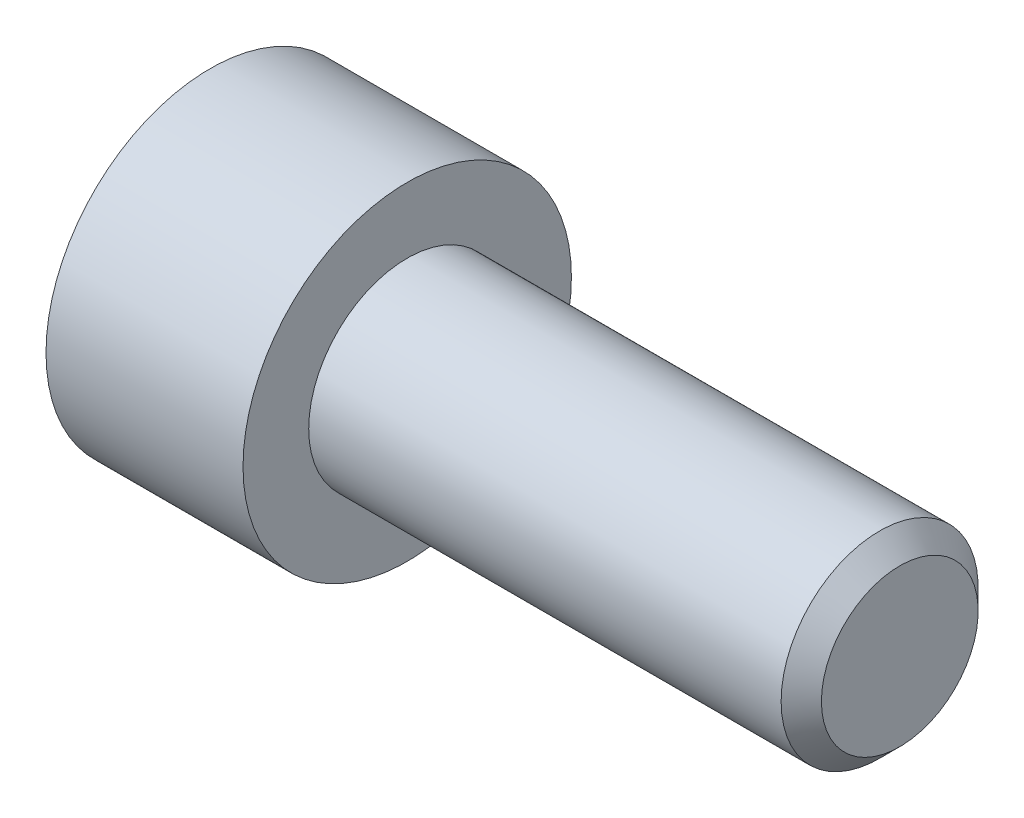
ISO-10303-21;
HEADER;
FILE_DESCRIPTION(('STEP AP214'),'2;1');
FILE_NAME('part.step','',(''),(''),'','','');
FILE_SCHEMA(('AUTOMOTIVE_DESIGN { 1 0 10303 214 1 1 1 1 }'));
ENDSEC;
DATA;
#1=APPLICATION_CONTEXT('core data for automotive mechanical design processes');
#2=APPLICATION_PROTOCOL_DEFINITION('international standard','automotive_design',2000,#1);
#3=PRODUCT_CONTEXT('',#1,'mechanical');
#4=PRODUCT('Part','Part','',(#3));
#5=PRODUCT_RELATED_PRODUCT_CATEGORY('part','',(#4));
#6=PRODUCT_DEFINITION_FORMATION('','',#4);
#7=PRODUCT_DEFINITION_CONTEXT('part definition',#1,'design');
#8=PRODUCT_DEFINITION('design','',#6,#7);
#9=PRODUCT_DEFINITION_SHAPE('','',#8);
#10=(LENGTH_UNIT() NAMED_UNIT(*) SI_UNIT(.MILLI.,.METRE.));
#11=(NAMED_UNIT(*) PLANE_ANGLE_UNIT() SI_UNIT($,.RADIAN.));
#12=(NAMED_UNIT(*) SI_UNIT($,.STERADIAN.) SOLID_ANGLE_UNIT());
#13=UNCERTAINTY_MEASURE_WITH_UNIT(LENGTH_MEASURE(1.E-05),#10,'distance_accuracy_value','');
#14=(GEOMETRIC_REPRESENTATION_CONTEXT(3) GLOBAL_UNCERTAINTY_ASSIGNED_CONTEXT((#13)) GLOBAL_UNIT_ASSIGNED_CONTEXT((#10,
#11,#12)) REPRESENTATION_CONTEXT('',''));
#15=CARTESIAN_POINT('',(0.,0.,0.));
#16=DIRECTION('',(0.,0.,1.));
#17=DIRECTION('',(1.,0.,0.));
#18=AXIS2_PLACEMENT_3D('',#15,#16,#17);
#19=CARTESIAN_POINT('',(-6.,0.,0.));
#20=DIRECTION('',(1.,0.,0.));
#21=DIRECTION('',(0.,0.,-1.));
#22=AXIS2_PLACEMENT_3D('',#19,#20,#21);
#23=PLANE('',#22);
#24=CARTESIAN_POINT('',(-6.,0.,0.));
#25=DIRECTION('',(-1.,0.,0.));
#26=DIRECTION('',(0.,0.,1.));
#27=AXIS2_PLACEMENT_3D('',#24,#25,#26);
#28=CIRCLE('',#27,5.);
#29=CARTESIAN_POINT('',(-6.,0.,5.));
#30=VERTEX_POINT('',#29);
#31=EDGE_CURVE('E11',#30,#30,#28,.T.);
#32=ORIENTED_EDGE('',*,*,#31,.T.);
#33=EDGE_LOOP('',(#32));
#34=FACE_BOUND('',#33,.T.);
#35=DIRECTION('',(0.,-0.5,-0.866025403784439));
#36=VECTOR('',#35,1.);
#37=CARTESIAN_POINT('',(-6.,-1.44337567297406,2.5));
#38=LINE('',#37,#36);
#39=CARTESIAN_POINT('',(-6.,-1.44337567297406,2.5));
#40=VERTEX_POINT('',#39);
#41=CARTESIAN_POINT('',(-6.,-2.88675134594813,0.));
#42=VERTEX_POINT('',#41);
#43=EDGE_CURVE('E195',#40,#42,#38,.T.);
#44=ORIENTED_EDGE('',*,*,#43,.T.);
#45=DIRECTION('',(0.,0.5,-0.866025403784439));
#46=VECTOR('',#45,1.);
#47=CARTESIAN_POINT('',(-6.,-2.88675134594813,0.));
#48=LINE('',#47,#46);
#49=CARTESIAN_POINT('',(-6.,-1.44337567297406,-2.5));
#50=VERTEX_POINT('',#49);
#51=EDGE_CURVE('E198',#42,#50,#48,.T.);
#52=ORIENTED_EDGE('',*,*,#51,.T.);
#53=DIRECTION('',(0.,1.,0.));
#54=VECTOR('',#53,1.);
#55=CARTESIAN_POINT('',(-6.,-1.44337567297406,-2.5));
#56=LINE('',#55,#54);
#57=CARTESIAN_POINT('',(-6.,1.44337567297406,-2.5));
#58=VERTEX_POINT('',#57);
#59=EDGE_CURVE('E210',#50,#58,#56,.T.);
#60=ORIENTED_EDGE('',*,*,#59,.T.);
#61=DIRECTION('',(0.,0.5,0.866025403784439));
#62=VECTOR('',#61,1.);
#63=CARTESIAN_POINT('',(-6.,1.44337567297406,-2.5));
#64=LINE('',#63,#62);
#65=CARTESIAN_POINT('',(-6.,2.88675134594813,0.));
#66=VERTEX_POINT('',#65);
#67=EDGE_CURVE('E121',#58,#66,#64,.T.);
#68=ORIENTED_EDGE('',*,*,#67,.T.);
#69=DIRECTION('',(0.,-0.5,0.866025403784439));
#70=VECTOR('',#69,1.);
#71=CARTESIAN_POINT('',(-6.,2.88675134594813,0.));
#72=LINE('',#71,#70);
#73=CARTESIAN_POINT('',(-6.,1.44337567297406,2.5));
#74=VERTEX_POINT('',#73);
#75=EDGE_CURVE('E234',#66,#74,#72,.T.);
#76=ORIENTED_EDGE('',*,*,#75,.T.);
#77=DIRECTION('',(0.,-1.,0.));
#78=VECTOR('',#77,1.);
#79=CARTESIAN_POINT('',(-6.,1.44337567297406,2.5));
#80=LINE('',#79,#78);
#81=EDGE_CURVE('E136',#74,#40,#80,.T.);
#82=ORIENTED_EDGE('',*,*,#81,.T.);
#83=EDGE_LOOP('',(#44,#52,#60,#68,#76,#82));
#84=FACE_BOUND('',#83,.T.);
#85=ADVANCED_FACE('F38',(#34,#84),#23,.F.);
#86=CARTESIAN_POINT('',(15.,0.,0.));
#87=DIRECTION('',(-1.,0.,0.));
#88=DIRECTION('',(0.,0.,1.));
#89=AXIS2_PLACEMENT_3D('',#86,#87,#88);
#90=CYLINDRICAL_SURFACE('',#89,5.);
#91=ORIENTED_EDGE('',*,*,#31,.F.);
#92=EDGE_LOOP('',(#91));
#93=FACE_BOUND('',#92,.T.);
#94=CARTESIAN_POINT('',(0.,0.,0.));
#95=DIRECTION('',(-1.,0.,0.));
#96=DIRECTION('',(0.,0.,1.));
#97=AXIS2_PLACEMENT_3D('',#94,#95,#96);
#98=CIRCLE('',#97,5.);
#99=CARTESIAN_POINT('',(0.,0.,5.));
#100=VERTEX_POINT('',#99);
#101=EDGE_CURVE('E45',#100,#100,#98,.T.);
#102=ORIENTED_EDGE('',*,*,#101,.T.);
#103=EDGE_LOOP('',(#102));
#104=FACE_BOUND('',#103,.T.);
#105=ADVANCED_FACE('F158',(#93,#104),#90,.T.);
#106=CARTESIAN_POINT('',(0.,5.,0.));
#107=DIRECTION('',(-1.,0.,0.));
#108=DIRECTION('',(0.,0.,1.));
#109=AXIS2_PLACEMENT_3D('',#106,#107,#108);
#110=PLANE('',#109);
#111=ORIENTED_EDGE('',*,*,#101,.F.);
#112=EDGE_LOOP('',(#111));
#113=FACE_BOUND('',#112,.T.);
#114=CARTESIAN_POINT('',(0.,0.,0.));
#115=DIRECTION('',(-1.,0.,0.));
#116=DIRECTION('',(0.,0.,1.));
#117=AXIS2_PLACEMENT_3D('',#114,#115,#116);
#118=CIRCLE('',#117,3.);
#119=CARTESIAN_POINT('',(0.,0.,3.));
#120=VERTEX_POINT('',#119);
#121=EDGE_CURVE('E153',#120,#120,#118,.T.);
#122=ORIENTED_EDGE('',*,*,#121,.T.);
#123=EDGE_LOOP('',(#122));
#124=FACE_BOUND('',#123,.T.);
#125=ADVANCED_FACE('F160',(#113,#124),#110,.F.);
#126=CARTESIAN_POINT('',(15.,0.,0.));
#127=DIRECTION('',(-1.,0.,0.));
#128=DIRECTION('',(0.,0.,1.));
#129=AXIS2_PLACEMENT_3D('',#126,#127,#128);
#130=CYLINDRICAL_SURFACE('',#129,3.);
#131=ORIENTED_EDGE('',*,*,#121,.F.);
#132=EDGE_LOOP('',(#131));
#133=FACE_BOUND('',#132,.T.);
#134=CARTESIAN_POINT('',(14.3865,0.,0.));
#135=DIRECTION('',(-1.,0.,0.));
#136=DIRECTION('',(0.,0.,1.));
#137=AXIS2_PLACEMENT_3D('',#134,#135,#136);
#138=CIRCLE('',#137,3.);
#139=CARTESIAN_POINT('',(14.3865,0.,3.));
#140=VERTEX_POINT('',#139);
#141=EDGE_CURVE('E150',#140,#140,#138,.T.);
#142=ORIENTED_EDGE('',*,*,#141,.T.);
#143=EDGE_LOOP('',(#142));
#144=FACE_BOUND('',#143,.T.);
#145=ADVANCED_FACE('F163',(#133,#144),#130,.T.);
#146=CARTESIAN_POINT('',(15.,0.,0.));
#147=DIRECTION('',(-1.,0.,0.));
#148=DIRECTION('',(0.,0.,1.));
#149=AXIS2_PLACEMENT_3D('',#146,#147,#148);
#150=CONICAL_SURFACE('',#149,2.3865,0.785398163397449);
#151=ORIENTED_EDGE('',*,*,#141,.F.);
#152=EDGE_LOOP('',(#151));
#153=FACE_BOUND('',#152,.T.);
#154=CARTESIAN_POINT('',(15.,0.,0.));
#155=DIRECTION('',(-1.,0.,0.));
#156=DIRECTION('',(0.,0.,1.));
#157=AXIS2_PLACEMENT_3D('',#154,#155,#156);
#158=CIRCLE('',#157,2.3865);
#159=CARTESIAN_POINT('',(15.,0.,2.3865));
#160=VERTEX_POINT('',#159);
#161=EDGE_CURVE('E146',#160,#160,#158,.T.);
#162=ORIENTED_EDGE('',*,*,#161,.T.);
#163=EDGE_LOOP('',(#162));
#164=FACE_BOUND('',#163,.T.);
#165=ADVANCED_FACE('F169',(#153,#164),#150,.T.);
#166=CARTESIAN_POINT('',(15.,2.3865,0.));
#167=DIRECTION('',(-1.,0.,0.));
#168=DIRECTION('',(0.,0.,1.));
#169=AXIS2_PLACEMENT_3D('',#166,#167,#168);
#170=PLANE('',#169);
#171=ORIENTED_EDGE('',*,*,#161,.F.);
#172=EDGE_LOOP('',(#171));
#173=FACE_BOUND('',#172,.T.);
#174=ADVANCED_FACE('F175',(#173),#170,.F.);
#175=CARTESIAN_POINT('',(-3.,2.88675134594813,0.));
#176=DIRECTION('',(0.,-0.866025403784439,-0.5));
#177=DIRECTION('',(0.,0.5,-0.866025403784439));
#178=AXIS2_PLACEMENT_3D('',#175,#176,#177);
#179=PLANE('',#178);
#180=DIRECTION('',(0.,-0.5,0.866025403784439));
#181=VECTOR('',#180,1.);
#182=CARTESIAN_POINT('',(-3.,2.88675134594813,0.));
#183=LINE('',#182,#181);
#184=CARTESIAN_POINT('',(-3.,2.88675134594813,0.));
#185=VERTEX_POINT('',#184);
#186=CARTESIAN_POINT('',(-3.,2.1650635094611,1.25));
#187=VERTEX_POINT('',#186);
#188=EDGE_CURVE('E118',#185,#187,#183,.T.);
#189=ORIENTED_EDGE('',*,*,#188,.T.);
#190=CARTESIAN_POINT('',(-3.,1.44337567297406,2.5));
#191=VERTEX_POINT('',#190);
#192=EDGE_CURVE('E110',#187,#191,#183,.T.);
#193=ORIENTED_EDGE('',*,*,#192,.T.);
#194=DIRECTION('',(-1.,0.,0.));
#195=VECTOR('',#194,1.);
#196=CARTESIAN_POINT('',(-3.,1.44337567297406,2.5));
#197=LINE('',#196,#195);
#198=EDGE_CURVE('E115',#191,#74,#197,.T.);
#199=ORIENTED_EDGE('',*,*,#198,.T.);
#200=ORIENTED_EDGE('',*,*,#75,.F.);
#201=DIRECTION('',(-1.,0.,0.));
#202=VECTOR('',#201,1.);
#203=CARTESIAN_POINT('',(-3.,2.88675134594813,0.));
#204=LINE('',#203,#202);
#205=EDGE_CURVE('E216',#185,#66,#204,.T.);
#206=ORIENTED_EDGE('',*,*,#205,.F.);
#207=EDGE_LOOP('',(#189,#193,#199,#200,#206));
#208=FACE_BOUND('',#207,.T.);
#209=ADVANCED_FACE('F112',(#208),#179,.T.);
#210=CARTESIAN_POINT('',(-3.,1.44337567297406,2.5));
#211=DIRECTION('',(0.,0.,-1.));
#212=DIRECTION('',(-1.,0.,0.));
#213=AXIS2_PLACEMENT_3D('',#210,#211,#212);
#214=PLANE('',#213);
#215=DIRECTION('',(0.,-1.,0.));
#216=VECTOR('',#215,1.);
#217=CARTESIAN_POINT('',(-3.,1.44337567297406,2.5));
#218=LINE('',#217,#216);
#219=CARTESIAN_POINT('',(-3.,0.,2.5));
#220=VERTEX_POINT('',#219);
#221=EDGE_CURVE('E124',#191,#220,#218,.T.);
#222=ORIENTED_EDGE('',*,*,#221,.T.);
#223=CARTESIAN_POINT('',(-3.,-1.44337567297406,2.5));
#224=VERTEX_POINT('',#223);
#225=EDGE_CURVE('E131',#220,#224,#218,.T.);
#226=ORIENTED_EDGE('',*,*,#225,.T.);
#227=DIRECTION('',(-1.,0.,0.));
#228=VECTOR('',#227,1.);
#229=CARTESIAN_POINT('',(-3.,-1.44337567297406,2.5));
#230=LINE('',#229,#228);
#231=EDGE_CURVE('E138',#224,#40,#230,.T.);
#232=ORIENTED_EDGE('',*,*,#231,.T.);
#233=ORIENTED_EDGE('',*,*,#81,.F.);
#234=ORIENTED_EDGE('',*,*,#198,.F.);
#235=EDGE_LOOP('',(#222,#226,#232,#233,#234));
#236=FACE_BOUND('',#235,.T.);
#237=ADVANCED_FACE('F134',(#236),#214,.T.);
#238=CARTESIAN_POINT('',(-3.,-1.44337567297406,2.5));
#239=DIRECTION('',(0.,0.866025403784439,-0.5));
#240=DIRECTION('',(0.,0.5,0.866025403784439));
#241=AXIS2_PLACEMENT_3D('',#238,#239,#240);
#242=PLANE('',#241);
#243=DIRECTION('',(0.,-0.5,-0.866025403784439));
#244=VECTOR('',#243,1.);
#245=CARTESIAN_POINT('',(-3.,-1.44337567297406,2.5));
#246=LINE('',#245,#244);
#247=CARTESIAN_POINT('',(-3.,-2.1650635094611,1.25));
#248=VERTEX_POINT('',#247);
#249=EDGE_CURVE('E243',#224,#248,#246,.T.);
#250=ORIENTED_EDGE('',*,*,#249,.T.);
#251=CARTESIAN_POINT('',(-3.,-2.88675134594813,0.));
#252=VERTEX_POINT('',#251);
#253=EDGE_CURVE('E130',#248,#252,#246,.T.);
#254=ORIENTED_EDGE('',*,*,#253,.T.);
#255=DIRECTION('',(-1.,0.,0.));
#256=VECTOR('',#255,1.);
#257=CARTESIAN_POINT('',(-3.,-2.88675134594813,0.));
#258=LINE('',#257,#256);
#259=EDGE_CURVE('E142',#252,#42,#258,.T.);
#260=ORIENTED_EDGE('',*,*,#259,.T.);
#261=ORIENTED_EDGE('',*,*,#43,.F.);
#262=ORIENTED_EDGE('',*,*,#231,.F.);
#263=EDGE_LOOP('',(#250,#254,#260,#261,#262));
#264=FACE_BOUND('',#263,.T.);
#265=ADVANCED_FACE('F204',(#264),#242,.T.);
#266=CARTESIAN_POINT('',(-3.,-2.88675134594813,0.));
#267=DIRECTION('',(0.,0.866025403784439,0.5));
#268=DIRECTION('',(0.,-0.5,0.866025403784439));
#269=AXIS2_PLACEMENT_3D('',#266,#267,#268);
#270=PLANE('',#269);
#271=DIRECTION('',(0.,0.5,-0.866025403784439));
#272=VECTOR('',#271,1.);
#273=CARTESIAN_POINT('',(-3.,-2.88675134594813,0.));
#274=LINE('',#273,#272);
#275=CARTESIAN_POINT('',(-3.,-2.1650635094611,-1.25));
#276=VERTEX_POINT('',#275);
#277=EDGE_CURVE('E52',#252,#276,#274,.T.);
#278=ORIENTED_EDGE('',*,*,#277,.T.);
#279=CARTESIAN_POINT('',(-3.,-1.44337567297406,-2.5));
#280=VERTEX_POINT('',#279);
#281=EDGE_CURVE('E242',#276,#280,#274,.T.);
#282=ORIENTED_EDGE('',*,*,#281,.T.);
#283=DIRECTION('',(-1.,0.,0.));
#284=VECTOR('',#283,1.);
#285=CARTESIAN_POINT('',(-3.,-1.44337567297406,-2.5));
#286=LINE('',#285,#284);
#287=EDGE_CURVE('E206',#280,#50,#286,.T.);
#288=ORIENTED_EDGE('',*,*,#287,.T.);
#289=ORIENTED_EDGE('',*,*,#51,.F.);
#290=ORIENTED_EDGE('',*,*,#259,.F.);
#291=EDGE_LOOP('',(#278,#282,#288,#289,#290));
#292=FACE_BOUND('',#291,.T.);
#293=ADVANCED_FACE('F207',(#292),#270,.T.);
#294=CARTESIAN_POINT('',(-3.,-1.44337567297406,-2.5));
#295=DIRECTION('',(0.,0.,1.));
#296=DIRECTION('',(1.,0.,0.));
#297=AXIS2_PLACEMENT_3D('',#294,#295,#296);
#298=PLANE('',#297);
#299=DIRECTION('',(0.,1.,0.));
#300=VECTOR('',#299,1.);
#301=CARTESIAN_POINT('',(-3.,-1.44337567297406,-2.5));
#302=LINE('',#301,#300);
#303=CARTESIAN_POINT('',(-3.,0.,-2.5));
#304=VERTEX_POINT('',#303);
#305=EDGE_CURVE('E239',#280,#304,#302,.T.);
#306=ORIENTED_EDGE('',*,*,#305,.T.);
#307=CARTESIAN_POINT('',(-3.,1.44337567297406,-2.5));
#308=VERTEX_POINT('',#307);
#309=EDGE_CURVE('E229',#304,#308,#302,.T.);
#310=ORIENTED_EDGE('',*,*,#309,.T.);
#311=DIRECTION('',(-1.,0.,0.));
#312=VECTOR('',#311,1.);
#313=CARTESIAN_POINT('',(-3.,1.44337567297406,-2.5));
#314=LINE('',#313,#312);
#315=EDGE_CURVE('E219',#308,#58,#314,.T.);
#316=ORIENTED_EDGE('',*,*,#315,.T.);
#317=ORIENTED_EDGE('',*,*,#59,.F.);
#318=ORIENTED_EDGE('',*,*,#287,.F.);
#319=EDGE_LOOP('',(#306,#310,#316,#317,#318));
#320=FACE_BOUND('',#319,.T.);
#321=ADVANCED_FACE('F227',(#320),#298,.T.);
#322=CARTESIAN_POINT('',(-3.,1.44337567297406,-2.5));
#323=DIRECTION('',(0.,-0.866025403784439,0.5));
#324=DIRECTION('',(0.,-0.5,-0.866025403784439));
#325=AXIS2_PLACEMENT_3D('',#322,#323,#324);
#326=PLANE('',#325);
#327=DIRECTION('',(0.,0.5,0.866025403784439));
#328=VECTOR('',#327,1.);
#329=CARTESIAN_POINT('',(-3.,1.44337567297406,-2.5));
#330=LINE('',#329,#328);
#331=CARTESIAN_POINT('',(-3.,2.1650635094611,-1.25));
#332=VERTEX_POINT('',#331);
#333=EDGE_CURVE('E220',#308,#332,#330,.T.);
#334=ORIENTED_EDGE('',*,*,#333,.T.);
#335=EDGE_CURVE('E238',#332,#185,#330,.T.);
#336=ORIENTED_EDGE('',*,*,#335,.T.);
#337=ORIENTED_EDGE('',*,*,#205,.T.);
#338=ORIENTED_EDGE('',*,*,#67,.F.);
#339=ORIENTED_EDGE('',*,*,#315,.F.);
#340=EDGE_LOOP('',(#334,#336,#337,#338,#339));
#341=FACE_BOUND('',#340,.T.);
#342=ADVANCED_FACE('F233',(#341),#326,.T.);
#343=CARTESIAN_POINT('',(-3.,1.44337567297406,2.5));
#344=DIRECTION('',(1.,0.,0.));
#345=DIRECTION('',(0.,0.,-1.));
#346=AXIS2_PLACEMENT_3D('',#343,#344,#345);
#347=PLANE('',#346);
#348=CARTESIAN_POINT('',(-3.,0.,0.));
#349=DIRECTION('',(-1.,0.,0.));
#350=DIRECTION('',(0.,0.,1.));
#351=AXIS2_PLACEMENT_3D('',#348,#349,#350);
#352=CIRCLE('',#351,2.5);
#353=EDGE_CURVE('E257',#332,#304,#352,.T.);
#354=ORIENTED_EDGE('',*,*,#353,.F.);
#355=ORIENTED_EDGE('',*,*,#333,.F.);
#356=ORIENTED_EDGE('',*,*,#309,.F.);
#357=EDGE_LOOP('',(#354,#355,#356));
#358=FACE_BOUND('',#357,.T.);
#359=ADVANCED_FACE('F264',(#358),#347,.F.);
#360=EDGE_CURVE('E147',#187,#332,#352,.T.);
#361=ORIENTED_EDGE('',*,*,#360,.F.);
#362=ORIENTED_EDGE('',*,*,#188,.F.);
#363=ORIENTED_EDGE('',*,*,#335,.F.);
#364=EDGE_LOOP('',(#361,#362,#363));
#365=FACE_BOUND('',#364,.T.);
#366=ADVANCED_FACE('F262',(#365),#347,.F.);
#367=EDGE_CURVE('E126',#220,#187,#352,.T.);
#368=ORIENTED_EDGE('',*,*,#367,.F.);
#369=ORIENTED_EDGE('',*,*,#221,.F.);
#370=ORIENTED_EDGE('',*,*,#192,.F.);
#371=EDGE_LOOP('',(#368,#369,#370));
#372=FACE_BOUND('',#371,.T.);
#373=ADVANCED_FACE('F125',(#372),#347,.F.);
#374=EDGE_CURVE('E137',#248,#220,#352,.T.);
#375=ORIENTED_EDGE('',*,*,#374,.F.);
#376=ORIENTED_EDGE('',*,*,#249,.F.);
#377=ORIENTED_EDGE('',*,*,#225,.F.);
#378=EDGE_LOOP('',(#375,#376,#377));
#379=FACE_BOUND('',#378,.T.);
#380=ADVANCED_FACE('F247',(#379),#347,.F.);
#381=EDGE_CURVE('E140',#276,#248,#352,.T.);
#382=ORIENTED_EDGE('',*,*,#381,.F.);
#383=ORIENTED_EDGE('',*,*,#277,.F.);
#384=ORIENTED_EDGE('',*,*,#253,.F.);
#385=EDGE_LOOP('',(#382,#383,#384));
#386=FACE_BOUND('',#385,.T.);
#387=ADVANCED_FACE('F251',(#386),#347,.F.);
#388=EDGE_CURVE('E253',#304,#276,#352,.T.);
#389=ORIENTED_EDGE('',*,*,#388,.F.);
#390=ORIENTED_EDGE('',*,*,#305,.F.);
#391=ORIENTED_EDGE('',*,*,#281,.F.);
#392=EDGE_LOOP('',(#389,#390,#391));
#393=FACE_BOUND('',#392,.T.);
#394=ADVANCED_FACE('F265',(#393),#347,.F.);
#395=CARTESIAN_POINT('',(-2.33012701892219,0.,0.));
#396=DIRECTION('',(-1.,0.,0.));
#397=DIRECTION('',(0.,0.,1.));
#398=AXIS2_PLACEMENT_3D('',#395,#396,#397);
#399=CONICAL_SURFACE('',#398,0.,1.30899693899575);
#400=ORIENTED_EDGE('',*,*,#367,.T.);
#401=ORIENTED_EDGE('',*,*,#360,.T.);
#402=ORIENTED_EDGE('',*,*,#353,.T.);
#403=ORIENTED_EDGE('',*,*,#388,.T.);
#404=ORIENTED_EDGE('',*,*,#381,.T.);
#405=ORIENTED_EDGE('',*,*,#374,.T.);
#406=EDGE_LOOP('',(#400,#401,#402,#403,#404,#405));
#407=FACE_BOUND('',#406,.T.);
#408=CARTESIAN_POINT('',(-2.33012701892219,0.,0.));
#409=VERTEX_POINT('',#408);
#410=VERTEX_LOOP('',#409);
#411=FACE_BOUND('',#410,.T.);
#412=ADVANCED_FACE('F255',(#407,#411),#399,.F.);
#413=CLOSED_SHELL('',(#85,#105,#125,#145,#165,#174,#209,#237,#265,#293,#321,#342,#359,#366,#373,
#380,#387,#394,#412));
#414=MANIFOLD_SOLID_BREP('B2',#413);
#415=ADVANCED_BREP_SHAPE_REPRESENTATION('',(#18,#414),#14);
#416=SHAPE_DEFINITION_REPRESENTATION(#9,#415);
ENDSEC;
END-ISO-10303-21;
